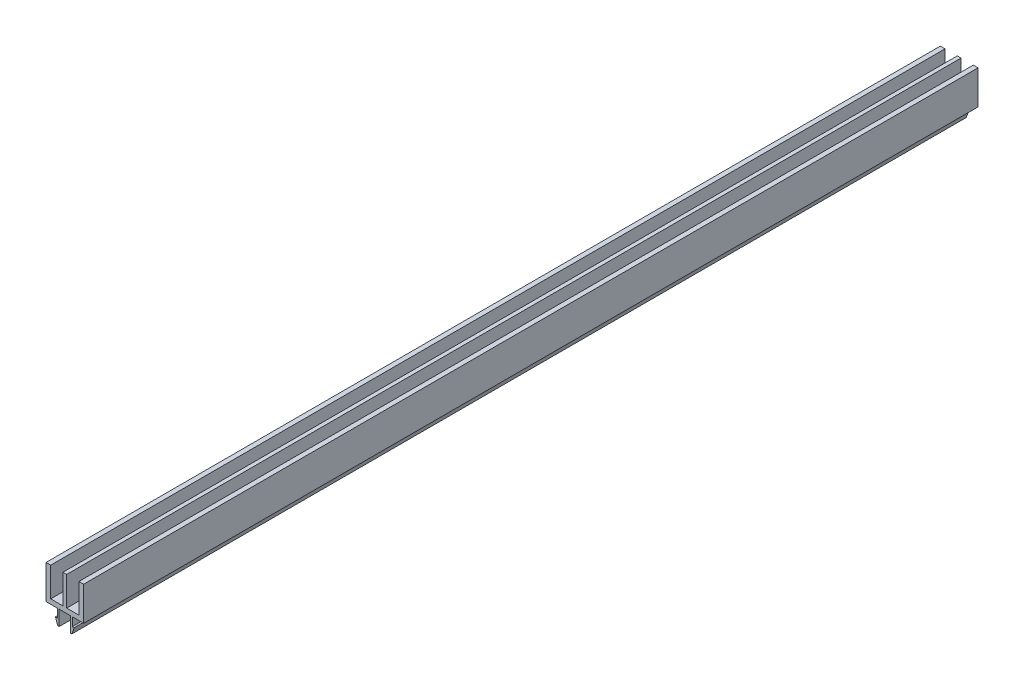
ISO-10303-21;
HEADER;
FILE_DESCRIPTION(('STEP AP214'),'2;1');
FILE_NAME('part.step','',(''),(''),'','','');
FILE_SCHEMA(('AUTOMOTIVE_DESIGN { 1 0 10303 214 1 1 1 1 }'));
ENDSEC;
DATA;
#1=APPLICATION_CONTEXT('core data for automotive mechanical design processes');
#2=APPLICATION_PROTOCOL_DEFINITION('international standard','automotive_design',2000,#1);
#3=PRODUCT_CONTEXT('',#1,'mechanical');
#4=PRODUCT('Part','Part','',(#3));
#5=PRODUCT_RELATED_PRODUCT_CATEGORY('part','',(#4));
#6=PRODUCT_DEFINITION_FORMATION('','',#4);
#7=PRODUCT_DEFINITION_CONTEXT('part definition',#1,'design');
#8=PRODUCT_DEFINITION('design','',#6,#7);
#9=PRODUCT_DEFINITION_SHAPE('','',#8);
#10=(LENGTH_UNIT() NAMED_UNIT(*) SI_UNIT(.MILLI.,.METRE.));
#11=(NAMED_UNIT(*) PLANE_ANGLE_UNIT() SI_UNIT($,.RADIAN.));
#12=(NAMED_UNIT(*) SI_UNIT($,.STERADIAN.) SOLID_ANGLE_UNIT());
#13=UNCERTAINTY_MEASURE_WITH_UNIT(LENGTH_MEASURE(1.E-05),#10,'distance_accuracy_value','');
#14=(GEOMETRIC_REPRESENTATION_CONTEXT(3) GLOBAL_UNCERTAINTY_ASSIGNED_CONTEXT((#13)) GLOBAL_UNIT_ASSIGNED_CONTEXT((#10,
#11,#12)) REPRESENTATION_CONTEXT('',''));
#15=CARTESIAN_POINT('',(0.,0.,0.));
#16=DIRECTION('',(0.,0.,1.));
#17=DIRECTION('',(1.,0.,0.));
#18=AXIS2_PLACEMENT_3D('',#15,#16,#17);
#19=CARTESIAN_POINT('',(-1.,17.9999999975,-425.));
#20=DIRECTION('',(-1.,0.,0.));
#21=DIRECTION('',(0.,-1.,0.));
#22=AXIS2_PLACEMENT_3D('',#19,#20,#21);
#23=PLANE('',#22);
#24=DIRECTION('',(0.,-1.,0.));
#25=VECTOR('',#24,1.);
#26=CARTESIAN_POINT('',(-1.,17.9999999975,50.));
#27=LINE('',#26,#25);
#28=CARTESIAN_POINT('',(-1.,17.9999999975,50.));
#29=VERTEX_POINT('',#28);
#30=CARTESIAN_POINT('',(-1.,2.4999999995,50.));
#31=VERTEX_POINT('',#30);
#32=EDGE_CURVE('E225',#29,#31,#27,.T.);
#33=ORIENTED_EDGE('',*,*,#32,.F.);
#34=DIRECTION('',(0.,0.,1.));
#35=VECTOR('',#34,1.);
#36=CARTESIAN_POINT('',(-1.,17.9999999975,-425.));
#37=LINE('',#36,#35);
#38=CARTESIAN_POINT('',(-1.,17.9999999975,-425.));
#39=VERTEX_POINT('',#38);
#40=EDGE_CURVE('E11',#39,#29,#37,.T.);
#41=ORIENTED_EDGE('',*,*,#40,.F.);
#42=DIRECTION('',(0.,-1.,0.));
#43=VECTOR('',#42,1.);
#44=CARTESIAN_POINT('',(-1.,17.9999999975,-425.));
#45=LINE('',#44,#43);
#46=CARTESIAN_POINT('',(-1.,2.4999999995,-425.));
#47=VERTEX_POINT('',#46);
#48=EDGE_CURVE('E293',#39,#47,#45,.T.);
#49=ORIENTED_EDGE('',*,*,#48,.T.);
#50=DIRECTION('',(0.,0.,1.));
#51=VECTOR('',#50,1.);
#52=CARTESIAN_POINT('',(-1.,2.4999999995,-425.));
#53=LINE('',#52,#51);
#54=EDGE_CURVE('E35',#47,#31,#53,.T.);
#55=ORIENTED_EDGE('',*,*,#54,.T.);
#56=EDGE_LOOP('',(#33,#41,#49,#55));
#57=FACE_BOUND('',#56,.T.);
#58=ADVANCED_FACE('F32',(#57),#23,.T.);
#59=CARTESIAN_POINT('',(0.999999999999998,17.9999999975,-425.));
#60=DIRECTION('',(0.,1.,0.));
#61=DIRECTION('',(0.,0.,1.));
#62=AXIS2_PLACEMENT_3D('',#59,#60,#61);
#63=PLANE('',#62);
#64=DIRECTION('',(-1.,0.,0.));
#65=VECTOR('',#64,1.);
#66=CARTESIAN_POINT('',(0.999999999999998,17.9999999975,50.));
#67=LINE('',#66,#65);
#68=CARTESIAN_POINT('',(0.999999999999998,17.9999999975,50.));
#69=VERTEX_POINT('',#68);
#70=EDGE_CURVE('E291',#69,#29,#67,.T.);
#71=ORIENTED_EDGE('',*,*,#70,.F.);
#72=DIRECTION('',(0.,0.,1.));
#73=VECTOR('',#72,1.);
#74=CARTESIAN_POINT('',(0.999999999999998,17.9999999975,-425.));
#75=LINE('',#74,#73);
#76=CARTESIAN_POINT('',(0.999999999999998,17.9999999975,-425.));
#77=VERTEX_POINT('',#76);
#78=EDGE_CURVE('E41',#77,#69,#75,.T.);
#79=ORIENTED_EDGE('',*,*,#78,.F.);
#80=DIRECTION('',(-1.,0.,0.));
#81=VECTOR('',#80,1.);
#82=CARTESIAN_POINT('',(0.999999999999998,17.9999999975,-425.));
#83=LINE('',#82,#81);
#84=EDGE_CURVE('E215',#77,#39,#83,.T.);
#85=ORIENTED_EDGE('',*,*,#84,.T.);
#86=ORIENTED_EDGE('',*,*,#40,.T.);
#87=EDGE_LOOP('',(#71,#79,#85,#86));
#88=FACE_BOUND('',#87,.T.);
#89=ADVANCED_FACE('F337',(#88),#63,.T.);
#90=CARTESIAN_POINT('',(0.999999999999998,2.4999999995,-425.));
#91=DIRECTION('',(1.,0.,0.));
#92=DIRECTION('',(0.,0.,-1.));
#93=AXIS2_PLACEMENT_3D('',#90,#91,#92);
#94=PLANE('',#93);
#95=DIRECTION('',(0.,1.,0.));
#96=VECTOR('',#95,1.);
#97=CARTESIAN_POINT('',(0.999999999999998,2.4999999995,50.));
#98=LINE('',#97,#96);
#99=CARTESIAN_POINT('',(0.999999999999998,2.4999999995,50.));
#100=VERTEX_POINT('',#99);
#101=EDGE_CURVE('E202',#100,#69,#98,.T.);
#102=ORIENTED_EDGE('',*,*,#101,.F.);
#103=DIRECTION('',(0.,0.,1.));
#104=VECTOR('',#103,1.);
#105=CARTESIAN_POINT('',(0.999999999999998,2.4999999995,-425.));
#106=LINE('',#105,#104);
#107=CARTESIAN_POINT('',(0.999999999999998,2.4999999995,-425.));
#108=VERTEX_POINT('',#107);
#109=EDGE_CURVE('E197',#108,#100,#106,.T.);
#110=ORIENTED_EDGE('',*,*,#109,.F.);
#111=DIRECTION('',(0.,1.,0.));
#112=VECTOR('',#111,1.);
#113=CARTESIAN_POINT('',(0.999999999999998,2.4999999995,-425.));
#114=LINE('',#113,#112);
#115=EDGE_CURVE('E200',#108,#77,#114,.T.);
#116=ORIENTED_EDGE('',*,*,#115,.T.);
#117=ORIENTED_EDGE('',*,*,#78,.T.);
#118=EDGE_LOOP('',(#102,#110,#116,#117));
#119=FACE_BOUND('',#118,.T.);
#120=ADVANCED_FACE('F199',(#119),#94,.T.);
#121=CARTESIAN_POINT('',(7.5,2.4999999995,-425.));
#122=DIRECTION('',(0.,1.,0.));
#123=DIRECTION('',(-1.,0.,0.));
#124=AXIS2_PLACEMENT_3D('',#121,#122,#123);
#125=PLANE('',#124);
#126=DIRECTION('',(-1.,0.,0.));
#127=VECTOR('',#126,1.);
#128=CARTESIAN_POINT('',(7.5,2.4999999995,50.));
#129=LINE('',#128,#127);
#130=CARTESIAN_POINT('',(7.5,2.4999999995,50.));
#131=VERTEX_POINT('',#130);
#132=EDGE_CURVE('E288',#131,#100,#129,.T.);
#133=ORIENTED_EDGE('',*,*,#132,.F.);
#134=DIRECTION('',(0.,0.,1.));
#135=VECTOR('',#134,1.);
#136=CARTESIAN_POINT('',(7.5,2.4999999995,-425.));
#137=LINE('',#136,#135);
#138=CARTESIAN_POINT('',(7.5,2.4999999995,-425.));
#139=VERTEX_POINT('',#138);
#140=EDGE_CURVE('E207',#139,#131,#137,.T.);
#141=ORIENTED_EDGE('',*,*,#140,.F.);
#142=DIRECTION('',(-1.,0.,0.));
#143=VECTOR('',#142,1.);
#144=CARTESIAN_POINT('',(7.5,2.4999999995,-425.));
#145=LINE('',#144,#143);
#146=EDGE_CURVE('E213',#139,#108,#145,.T.);
#147=ORIENTED_EDGE('',*,*,#146,.T.);
#148=ORIENTED_EDGE('',*,*,#109,.T.);
#149=EDGE_LOOP('',(#133,#141,#147,#148));
#150=FACE_BOUND('',#149,.T.);
#151=ADVANCED_FACE('F217',(#150),#125,.T.);
#152=CARTESIAN_POINT('',(7.5,17.9999999975,-425.));
#153=DIRECTION('',(-1.,0.,0.));
#154=DIRECTION('',(0.,-1.,0.));
#155=AXIS2_PLACEMENT_3D('',#152,#153,#154);
#156=PLANE('',#155);
#157=DIRECTION('',(0.,-1.,0.));
#158=VECTOR('',#157,1.);
#159=CARTESIAN_POINT('',(7.5,17.9999999975,50.));
#160=LINE('',#159,#158);
#161=CARTESIAN_POINT('',(7.5,17.9999999975,50.));
#162=VERTEX_POINT('',#161);
#163=EDGE_CURVE('E285',#162,#131,#160,.T.);
#164=ORIENTED_EDGE('',*,*,#163,.F.);
#165=DIRECTION('',(0.,0.,1.));
#166=VECTOR('',#165,1.);
#167=CARTESIAN_POINT('',(7.5,17.9999999975,-425.));
#168=LINE('',#167,#166);
#169=CARTESIAN_POINT('',(7.5,17.9999999975,-425.));
#170=VERTEX_POINT('',#169);
#171=EDGE_CURVE('E297',#170,#162,#168,.T.);
#172=ORIENTED_EDGE('',*,*,#171,.F.);
#173=DIRECTION('',(0.,-1.,0.));
#174=VECTOR('',#173,1.);
#175=CARTESIAN_POINT('',(7.5,17.9999999975,-425.));
#176=LINE('',#175,#174);
#177=EDGE_CURVE('E218',#170,#139,#176,.T.);
#178=ORIENTED_EDGE('',*,*,#177,.T.);
#179=ORIENTED_EDGE('',*,*,#140,.T.);
#180=EDGE_LOOP('',(#164,#172,#178,#179));
#181=FACE_BOUND('',#180,.T.);
#182=ADVANCED_FACE('F350',(#181),#156,.T.);
#183=CARTESIAN_POINT('',(10.,17.9999999975,-425.));
#184=DIRECTION('',(0.,1.,0.));
#185=DIRECTION('',(0.,0.,1.));
#186=AXIS2_PLACEMENT_3D('',#183,#184,#185);
#187=PLANE('',#186);
#188=DIRECTION('',(-1.,0.,0.));
#189=VECTOR('',#188,1.);
#190=CARTESIAN_POINT('',(10.,17.9999999975,50.));
#191=LINE('',#190,#189);
#192=CARTESIAN_POINT('',(10.,17.9999999975,50.));
#193=VERTEX_POINT('',#192);
#194=EDGE_CURVE('E282',#193,#162,#191,.T.);
#195=ORIENTED_EDGE('',*,*,#194,.F.);
#196=DIRECTION('',(0.,0.,1.));
#197=VECTOR('',#196,1.);
#198=CARTESIAN_POINT('',(10.,17.9999999975,-425.));
#199=LINE('',#198,#197);
#200=CARTESIAN_POINT('',(10.,17.9999999975,-425.));
#201=VERTEX_POINT('',#200);
#202=EDGE_CURVE('E299',#201,#193,#199,.T.);
#203=ORIENTED_EDGE('',*,*,#202,.F.);
#204=DIRECTION('',(-1.,0.,0.));
#205=VECTOR('',#204,1.);
#206=CARTESIAN_POINT('',(10.,17.9999999975,-425.));
#207=LINE('',#206,#205);
#208=EDGE_CURVE('E220',#201,#170,#207,.T.);
#209=ORIENTED_EDGE('',*,*,#208,.T.);
#210=ORIENTED_EDGE('',*,*,#171,.T.);
#211=EDGE_LOOP('',(#195,#203,#209,#210));
#212=FACE_BOUND('',#211,.T.);
#213=ADVANCED_FACE('F353',(#212),#187,.T.);
#214=CARTESIAN_POINT('',(10.,-4.99999828349541E-10,-425.));
#215=DIRECTION('',(1.,0.,0.));
#216=DIRECTION('',(0.,0.,-1.));
#217=AXIS2_PLACEMENT_3D('',#214,#215,#216);
#218=PLANE('',#217);
#219=DIRECTION('',(0.,1.,0.));
#220=VECTOR('',#219,1.);
#221=CARTESIAN_POINT('',(10.,-4.99999828349541E-10,50.));
#222=LINE('',#221,#220);
#223=CARTESIAN_POINT('',(10.,-4.99999828349541E-10,50.));
#224=VERTEX_POINT('',#223);
#225=EDGE_CURVE('E279',#224,#193,#222,.T.);
#226=ORIENTED_EDGE('',*,*,#225,.F.);
#227=DIRECTION('',(0.,0.,1.));
#228=VECTOR('',#227,1.);
#229=CARTESIAN_POINT('',(10.,-4.99999828349541E-10,-425.));
#230=LINE('',#229,#228);
#231=CARTESIAN_POINT('',(10.,-4.99999828349541E-10,-425.));
#232=VERTEX_POINT('',#231);
#233=EDGE_CURVE('E301',#232,#224,#230,.T.);
#234=ORIENTED_EDGE('',*,*,#233,.F.);
#235=DIRECTION('',(0.,1.,0.));
#236=VECTOR('',#235,1.);
#237=CARTESIAN_POINT('',(10.,-4.99999828349541E-10,-425.));
#238=LINE('',#237,#236);
#239=EDGE_CURVE('E643',#232,#201,#238,.T.);
#240=ORIENTED_EDGE('',*,*,#239,.T.);
#241=ORIENTED_EDGE('',*,*,#202,.T.);
#242=EDGE_LOOP('',(#226,#234,#240,#241));
#243=FACE_BOUND('',#242,.T.);
#244=ADVANCED_FACE('F357',(#243),#218,.T.);
#245=CARTESIAN_POINT('',(4.,-4.99999998002099E-10,-425.));
#246=DIRECTION('',(0.,-1.,0.));
#247=DIRECTION('',(1.,0.,0.));
#248=AXIS2_PLACEMENT_3D('',#245,#246,#247);
#249=PLANE('',#248);
#250=DIRECTION('',(1.,0.,0.));
#251=VECTOR('',#250,1.);
#252=CARTESIAN_POINT('',(4.,-4.99999998002099E-10,50.));
#253=LINE('',#252,#251);
#254=CARTESIAN_POINT('',(4.,-4.99999998002099E-10,50.));
#255=VERTEX_POINT('',#254);
#256=EDGE_CURVE('E276',#255,#224,#253,.T.);
#257=ORIENTED_EDGE('',*,*,#256,.F.);
#258=DIRECTION('',(0.,0.,1.));
#259=VECTOR('',#258,1.);
#260=CARTESIAN_POINT('',(4.,-4.99999998002099E-10,-425.));
#261=LINE('',#260,#259);
#262=CARTESIAN_POINT('',(4.,-4.99999998002099E-10,-425.));
#263=VERTEX_POINT('',#262);
#264=EDGE_CURVE('E303',#263,#255,#261,.T.);
#265=ORIENTED_EDGE('',*,*,#264,.F.);
#266=DIRECTION('',(1.,0.,0.));
#267=VECTOR('',#266,1.);
#268=CARTESIAN_POINT('',(4.,-4.99999998002099E-10,-425.));
#269=LINE('',#268,#267);
#270=EDGE_CURVE('E647',#263,#232,#269,.T.);
#271=ORIENTED_EDGE('',*,*,#270,.T.);
#272=ORIENTED_EDGE('',*,*,#233,.T.);
#273=EDGE_LOOP('',(#257,#265,#271,#272));
#274=FACE_BOUND('',#273,.T.);
#275=ADVANCED_FACE('F361',(#274),#249,.T.);
#276=CARTESIAN_POINT('',(4.,-4.5,-425.));
#277=DIRECTION('',(1.,0.,0.));
#278=DIRECTION('',(0.,0.,-1.));
#279=AXIS2_PLACEMENT_3D('',#276,#277,#278);
#280=PLANE('',#279);
#281=DIRECTION('',(0.,1.,0.));
#282=VECTOR('',#281,1.);
#283=CARTESIAN_POINT('',(4.,-4.5,50.));
#284=LINE('',#283,#282);
#285=CARTESIAN_POINT('',(4.,-4.5,50.));
#286=VERTEX_POINT('',#285);
#287=EDGE_CURVE('E273',#286,#255,#284,.T.);
#288=ORIENTED_EDGE('',*,*,#287,.F.);
#289=DIRECTION('',(0.,0.,1.));
#290=VECTOR('',#289,1.);
#291=CARTESIAN_POINT('',(4.,-4.5,-425.));
#292=LINE('',#291,#290);
#293=CARTESIAN_POINT('',(4.,-4.5,-425.));
#294=VERTEX_POINT('',#293);
#295=EDGE_CURVE('E305',#294,#286,#292,.T.);
#296=ORIENTED_EDGE('',*,*,#295,.F.);
#297=DIRECTION('',(0.,1.,0.));
#298=VECTOR('',#297,1.);
#299=CARTESIAN_POINT('',(4.,-4.5,-425.));
#300=LINE('',#299,#298);
#301=EDGE_CURVE('E636',#294,#263,#300,.T.);
#302=ORIENTED_EDGE('',*,*,#301,.T.);
#303=ORIENTED_EDGE('',*,*,#264,.T.);
#304=EDGE_LOOP('',(#288,#296,#302,#303));
#305=FACE_BOUND('',#304,.T.);
#306=ADVANCED_FACE('F365',(#305),#280,.T.);
#307=CARTESIAN_POINT('',(5.,-4.5,-425.));
#308=DIRECTION('',(0.,1.,0.));
#309=DIRECTION('',(0.,0.,1.));
#310=AXIS2_PLACEMENT_3D('',#307,#308,#309);
#311=PLANE('',#310);
#312=DIRECTION('',(-1.,0.,0.));
#313=VECTOR('',#312,1.);
#314=CARTESIAN_POINT('',(5.,-4.5,50.));
#315=LINE('',#314,#313);
#316=CARTESIAN_POINT('',(5.,-4.5,50.));
#317=VERTEX_POINT('',#316);
#318=EDGE_CURVE('E270',#317,#286,#315,.T.);
#319=ORIENTED_EDGE('',*,*,#318,.F.);
#320=DIRECTION('',(0.,0.,1.));
#321=VECTOR('',#320,1.);
#322=CARTESIAN_POINT('',(5.,-4.5,-425.));
#323=LINE('',#322,#321);
#324=CARTESIAN_POINT('',(5.,-4.5,-425.));
#325=VERTEX_POINT('',#324);
#326=EDGE_CURVE('E307',#325,#317,#323,.T.);
#327=ORIENTED_EDGE('',*,*,#326,.F.);
#328=DIRECTION('',(-1.,0.,0.));
#329=VECTOR('',#328,1.);
#330=CARTESIAN_POINT('',(5.,-4.5,-425.));
#331=LINE('',#330,#329);
#332=EDGE_CURVE('E632',#325,#294,#331,.T.);
#333=ORIENTED_EDGE('',*,*,#332,.T.);
#334=ORIENTED_EDGE('',*,*,#295,.T.);
#335=EDGE_LOOP('',(#319,#327,#333,#334));
#336=FACE_BOUND('',#335,.T.);
#337=ADVANCED_FACE('F369',(#336),#311,.T.);
#338=CARTESIAN_POINT('',(3.75,-8.,-425.));
#339=DIRECTION('',(0.941741911594837,-0.336336396998156,0.));
#340=DIRECTION('',(0.336336396998157,0.941741911594838,0.));
#341=AXIS2_PLACEMENT_3D('',#338,#339,#340);
#342=PLANE('',#341);
#343=DIRECTION('',(0.336336396998157,0.941741911594837,0.));
#344=VECTOR('',#343,1.);
#345=CARTESIAN_POINT('',(3.75,-8.,50.));
#346=LINE('',#345,#344);
#347=CARTESIAN_POINT('',(3.75,-8.,50.));
#348=VERTEX_POINT('',#347);
#349=EDGE_CURVE('E267',#348,#317,#346,.T.);
#350=ORIENTED_EDGE('',*,*,#349,.F.);
#351=DIRECTION('',(0.,0.,1.));
#352=VECTOR('',#351,1.);
#353=CARTESIAN_POINT('',(3.75,-8.,-425.));
#354=LINE('',#353,#352);
#355=CARTESIAN_POINT('',(3.75,-8.,-425.));
#356=VERTEX_POINT('',#355);
#357=EDGE_CURVE('E309',#356,#348,#354,.T.);
#358=ORIENTED_EDGE('',*,*,#357,.F.);
#359=DIRECTION('',(0.336336396998157,0.941741911594837,0.));
#360=VECTOR('',#359,1.);
#361=CARTESIAN_POINT('',(3.75,-8.,-425.));
#362=LINE('',#361,#360);
#363=EDGE_CURVE('E653',#356,#325,#362,.T.);
#364=ORIENTED_EDGE('',*,*,#363,.T.);
#365=ORIENTED_EDGE('',*,*,#326,.T.);
#366=EDGE_LOOP('',(#350,#358,#364,#365));
#367=FACE_BOUND('',#366,.T.);
#368=ADVANCED_FACE('F373',(#367),#342,.T.);
#369=CARTESIAN_POINT('',(3.,-8.,-425.));
#370=DIRECTION('',(0.,-1.,0.));
#371=DIRECTION('',(0.,0.,-1.));
#372=AXIS2_PLACEMENT_3D('',#369,#370,#371);
#373=PLANE('',#372);
#374=DIRECTION('',(1.,0.,0.));
#375=VECTOR('',#374,1.);
#376=CARTESIAN_POINT('',(3.,-8.,50.));
#377=LINE('',#376,#375);
#378=CARTESIAN_POINT('',(3.,-8.,50.));
#379=VERTEX_POINT('',#378);
#380=EDGE_CURVE('E264',#379,#348,#377,.T.);
#381=ORIENTED_EDGE('',*,*,#380,.F.);
#382=DIRECTION('',(0.,0.,1.));
#383=VECTOR('',#382,1.);
#384=CARTESIAN_POINT('',(3.,-8.,-425.));
#385=LINE('',#384,#383);
#386=CARTESIAN_POINT('',(3.,-8.,-425.));
#387=VERTEX_POINT('',#386);
#388=EDGE_CURVE('E311',#387,#379,#385,.T.);
#389=ORIENTED_EDGE('',*,*,#388,.F.);
#390=DIRECTION('',(1.,0.,0.));
#391=VECTOR('',#390,1.);
#392=CARTESIAN_POINT('',(3.,-8.,-425.));
#393=LINE('',#392,#391);
#394=EDGE_CURVE('E625',#387,#356,#393,.T.);
#395=ORIENTED_EDGE('',*,*,#394,.T.);
#396=ORIENTED_EDGE('',*,*,#357,.T.);
#397=EDGE_LOOP('',(#381,#389,#395,#396));
#398=FACE_BOUND('',#397,.T.);
#399=ADVANCED_FACE('F377',(#398),#373,.T.);
#400=CARTESIAN_POINT('',(3.,-4.9999985194348E-10,-425.));
#401=DIRECTION('',(-1.,0.,0.));
#402=DIRECTION('',(0.,0.,1.));
#403=AXIS2_PLACEMENT_3D('',#400,#401,#402);
#404=PLANE('',#403);
#405=DIRECTION('',(0.,-1.,0.));
#406=VECTOR('',#405,1.);
#407=CARTESIAN_POINT('',(3.,-4.9999985194348E-10,50.));
#408=LINE('',#407,#406);
#409=CARTESIAN_POINT('',(3.,-4.9999985194348E-10,50.));
#410=VERTEX_POINT('',#409);
#411=EDGE_CURVE('E261',#410,#379,#408,.T.);
#412=ORIENTED_EDGE('',*,*,#411,.F.);
#413=DIRECTION('',(0.,0.,1.));
#414=VECTOR('',#413,1.);
#415=CARTESIAN_POINT('',(3.,-4.9999985194348E-10,-425.));
#416=LINE('',#415,#414);
#417=CARTESIAN_POINT('',(3.,-4.9999985194348E-10,-425.));
#418=VERTEX_POINT('',#417);
#419=EDGE_CURVE('E313',#418,#410,#416,.T.);
#420=ORIENTED_EDGE('',*,*,#419,.F.);
#421=DIRECTION('',(0.,-1.,0.));
#422=VECTOR('',#421,1.);
#423=CARTESIAN_POINT('',(3.,-4.9999985194348E-10,-425.));
#424=LINE('',#423,#422);
#425=EDGE_CURVE('E621',#418,#387,#424,.T.);
#426=ORIENTED_EDGE('',*,*,#425,.T.);
#427=ORIENTED_EDGE('',*,*,#388,.T.);
#428=EDGE_LOOP('',(#412,#420,#426,#427));
#429=FACE_BOUND('',#428,.T.);
#430=ADVANCED_FACE('F381',(#429),#404,.T.);
#431=CARTESIAN_POINT('',(-3.,-4.99999455901012E-10,-425.));
#432=DIRECTION('',(0.,-1.,0.));
#433=DIRECTION('',(1.,0.,0.));
#434=AXIS2_PLACEMENT_3D('',#431,#432,#433);
#435=PLANE('',#434);
#436=DIRECTION('',(1.,0.,0.));
#437=VECTOR('',#436,1.);
#438=CARTESIAN_POINT('',(-3.,-4.99999455901012E-10,50.));
#439=LINE('',#438,#437);
#440=CARTESIAN_POINT('',(-3.,-4.99999455901012E-10,50.));
#441=VERTEX_POINT('',#440);
#442=EDGE_CURVE('E258',#441,#410,#439,.T.);
#443=ORIENTED_EDGE('',*,*,#442,.F.);
#444=DIRECTION('',(0.,0.,1.));
#445=VECTOR('',#444,1.);
#446=CARTESIAN_POINT('',(-3.,-4.99999455901012E-10,-425.));
#447=LINE('',#446,#445);
#448=CARTESIAN_POINT('',(-3.,-4.99999455901012E-10,-425.));
#449=VERTEX_POINT('',#448);
#450=EDGE_CURVE('E315',#449,#441,#447,.T.);
#451=ORIENTED_EDGE('',*,*,#450,.F.);
#452=DIRECTION('',(1.,0.,0.));
#453=VECTOR('',#452,1.);
#454=CARTESIAN_POINT('',(-3.,-4.99999455901012E-10,-425.));
#455=LINE('',#454,#453);
#456=EDGE_CURVE('E657',#449,#418,#455,.T.);
#457=ORIENTED_EDGE('',*,*,#456,.T.);
#458=ORIENTED_EDGE('',*,*,#419,.T.);
#459=EDGE_LOOP('',(#443,#451,#457,#458));
#460=FACE_BOUND('',#459,.T.);
#461=ADVANCED_FACE('F385',(#460),#435,.T.);
#462=CARTESIAN_POINT('',(-3.,-8.,-425.));
#463=DIRECTION('',(1.,0.,0.));
#464=DIRECTION('',(0.,0.,-1.));
#465=AXIS2_PLACEMENT_3D('',#462,#463,#464);
#466=PLANE('',#465);
#467=DIRECTION('',(0.,1.,0.));
#468=VECTOR('',#467,1.);
#469=CARTESIAN_POINT('',(-3.,-8.,50.));
#470=LINE('',#469,#468);
#471=CARTESIAN_POINT('',(-3.,-8.,50.));
#472=VERTEX_POINT('',#471);
#473=EDGE_CURVE('E255',#472,#441,#470,.T.);
#474=ORIENTED_EDGE('',*,*,#473,.F.);
#475=DIRECTION('',(0.,0.,1.));
#476=VECTOR('',#475,1.);
#477=CARTESIAN_POINT('',(-3.,-8.,-425.));
#478=LINE('',#477,#476);
#479=CARTESIAN_POINT('',(-3.,-8.,-425.));
#480=VERTEX_POINT('',#479);
#481=EDGE_CURVE('E317',#480,#472,#478,.T.);
#482=ORIENTED_EDGE('',*,*,#481,.F.);
#483=DIRECTION('',(0.,1.,0.));
#484=VECTOR('',#483,1.);
#485=CARTESIAN_POINT('',(-3.,-8.,-425.));
#486=LINE('',#485,#484);
#487=EDGE_CURVE('E614',#480,#449,#486,.T.);
#488=ORIENTED_EDGE('',*,*,#487,.T.);
#489=ORIENTED_EDGE('',*,*,#450,.T.);
#490=EDGE_LOOP('',(#474,#482,#488,#489));
#491=FACE_BOUND('',#490,.T.);
#492=ADVANCED_FACE('F389',(#491),#466,.T.);
#493=CARTESIAN_POINT('',(-3.75,-8.,-425.));
#494=DIRECTION('',(0.,-1.,0.));
#495=DIRECTION('',(0.,0.,-1.));
#496=AXIS2_PLACEMENT_3D('',#493,#494,#495);
#497=PLANE('',#496);
#498=DIRECTION('',(1.,0.,0.));
#499=VECTOR('',#498,1.);
#500=CARTESIAN_POINT('',(-3.75,-8.,50.));
#501=LINE('',#500,#499);
#502=CARTESIAN_POINT('',(-3.75,-8.,50.));
#503=VERTEX_POINT('',#502);
#504=EDGE_CURVE('E252',#503,#472,#501,.T.);
#505=ORIENTED_EDGE('',*,*,#504,.F.);
#506=DIRECTION('',(0.,0.,1.));
#507=VECTOR('',#506,1.);
#508=CARTESIAN_POINT('',(-3.75,-8.,-425.));
#509=LINE('',#508,#507);
#510=CARTESIAN_POINT('',(-3.75,-8.,-425.));
#511=VERTEX_POINT('',#510);
#512=EDGE_CURVE('E319',#511,#503,#509,.T.);
#513=ORIENTED_EDGE('',*,*,#512,.F.);
#514=DIRECTION('',(1.,0.,0.));
#515=VECTOR('',#514,1.);
#516=CARTESIAN_POINT('',(-3.75,-8.,-425.));
#517=LINE('',#516,#515);
#518=EDGE_CURVE('E610',#511,#480,#517,.T.);
#519=ORIENTED_EDGE('',*,*,#518,.T.);
#520=ORIENTED_EDGE('',*,*,#481,.T.);
#521=EDGE_LOOP('',(#505,#513,#519,#520));
#522=FACE_BOUND('',#521,.T.);
#523=ADVANCED_FACE('F393',(#522),#497,.T.);
#524=CARTESIAN_POINT('',(-5.,-4.5,-425.));
#525=DIRECTION('',(-0.941741911594837,-0.336336396998156,0.));
#526=DIRECTION('',(0.336336396998156,-0.941741911594837,0.));
#527=AXIS2_PLACEMENT_3D('',#524,#525,#526);
#528=PLANE('',#527);
#529=DIRECTION('',(0.336336396998156,-0.941741911594837,0.));
#530=VECTOR('',#529,1.);
#531=CARTESIAN_POINT('',(-5.,-4.5,50.));
#532=LINE('',#531,#530);
#533=CARTESIAN_POINT('',(-5.,-4.5,50.));
#534=VERTEX_POINT('',#533);
#535=EDGE_CURVE('E249',#534,#503,#532,.T.);
#536=ORIENTED_EDGE('',*,*,#535,.F.);
#537=DIRECTION('',(0.,0.,1.));
#538=VECTOR('',#537,1.);
#539=CARTESIAN_POINT('',(-5.,-4.5,-425.));
#540=LINE('',#539,#538);
#541=CARTESIAN_POINT('',(-5.,-4.5,-425.));
#542=VERTEX_POINT('',#541);
#543=EDGE_CURVE('E321',#542,#534,#540,.T.);
#544=ORIENTED_EDGE('',*,*,#543,.F.);
#545=DIRECTION('',(0.336336396998156,-0.941741911594837,0.));
#546=VECTOR('',#545,1.);
#547=CARTESIAN_POINT('',(-5.,-4.5,-425.));
#548=LINE('',#547,#546);
#549=EDGE_CURVE('E661',#542,#511,#548,.T.);
#550=ORIENTED_EDGE('',*,*,#549,.T.);
#551=ORIENTED_EDGE('',*,*,#512,.T.);
#552=EDGE_LOOP('',(#536,#544,#550,#551));
#553=FACE_BOUND('',#552,.T.);
#554=ADVANCED_FACE('F397',(#553),#528,.T.);
#555=CARTESIAN_POINT('',(-4.,-4.5,-425.));
#556=DIRECTION('',(0.,1.,0.));
#557=DIRECTION('',(0.,0.,1.));
#558=AXIS2_PLACEMENT_3D('',#555,#556,#557);
#559=PLANE('',#558);
#560=DIRECTION('',(-1.,0.,0.));
#561=VECTOR('',#560,1.);
#562=CARTESIAN_POINT('',(-4.,-4.5,50.));
#563=LINE('',#562,#561);
#564=CARTESIAN_POINT('',(-4.,-4.5,50.));
#565=VERTEX_POINT('',#564);
#566=EDGE_CURVE('E246',#565,#534,#563,.T.);
#567=ORIENTED_EDGE('',*,*,#566,.F.);
#568=DIRECTION('',(0.,0.,1.));
#569=VECTOR('',#568,1.);
#570=CARTESIAN_POINT('',(-4.,-4.5,-425.));
#571=LINE('',#570,#569);
#572=CARTESIAN_POINT('',(-4.,-4.5,-425.));
#573=VERTEX_POINT('',#572);
#574=EDGE_CURVE('E323',#573,#565,#571,.T.);
#575=ORIENTED_EDGE('',*,*,#574,.F.);
#576=DIRECTION('',(-1.,0.,0.));
#577=VECTOR('',#576,1.);
#578=CARTESIAN_POINT('',(-4.,-4.5,-425.));
#579=LINE('',#578,#577);
#580=EDGE_CURVE('E603',#573,#542,#579,.T.);
#581=ORIENTED_EDGE('',*,*,#580,.T.);
#582=ORIENTED_EDGE('',*,*,#543,.T.);
#583=EDGE_LOOP('',(#567,#575,#581,#582));
#584=FACE_BOUND('',#583,.T.);
#585=ADVANCED_FACE('F401',(#584),#559,.T.);
#586=CARTESIAN_POINT('',(-4.,-4.9999985194348E-10,-425.));
#587=DIRECTION('',(-1.,0.,0.));
#588=DIRECTION('',(0.,0.,1.));
#589=AXIS2_PLACEMENT_3D('',#586,#587,#588);
#590=PLANE('',#589);
#591=DIRECTION('',(0.,-1.,0.));
#592=VECTOR('',#591,1.);
#593=CARTESIAN_POINT('',(-4.,-4.9999985194348E-10,50.));
#594=LINE('',#593,#592);
#595=CARTESIAN_POINT('',(-4.,-4.9999985194348E-10,50.));
#596=VERTEX_POINT('',#595);
#597=EDGE_CURVE('E243',#596,#565,#594,.T.);
#598=ORIENTED_EDGE('',*,*,#597,.F.);
#599=DIRECTION('',(0.,0.,1.));
#600=VECTOR('',#599,1.);
#601=CARTESIAN_POINT('',(-4.,-4.9999985194348E-10,-425.));
#602=LINE('',#601,#600);
#603=CARTESIAN_POINT('',(-4.,-4.9999985194348E-10,-425.));
#604=VERTEX_POINT('',#603);
#605=EDGE_CURVE('E325',#604,#596,#602,.T.);
#606=ORIENTED_EDGE('',*,*,#605,.F.);
#607=DIRECTION('',(0.,-1.,0.));
#608=VECTOR('',#607,1.);
#609=CARTESIAN_POINT('',(-4.,-4.9999985194348E-10,-425.));
#610=LINE('',#609,#608);
#611=EDGE_CURVE('E599',#604,#573,#610,.T.);
#612=ORIENTED_EDGE('',*,*,#611,.T.);
#613=ORIENTED_EDGE('',*,*,#574,.T.);
#614=EDGE_LOOP('',(#598,#606,#612,#613));
#615=FACE_BOUND('',#614,.T.);
#616=ADVANCED_FACE('F405',(#615),#590,.T.);
#617=CARTESIAN_POINT('',(-10.,-4.99999719929324E-10,-425.));
#618=DIRECTION('',(0.,-1.,0.));
#619=DIRECTION('',(1.,0.,0.));
#620=AXIS2_PLACEMENT_3D('',#617,#618,#619);
#621=PLANE('',#620);
#622=DIRECTION('',(1.,0.,0.));
#623=VECTOR('',#622,1.);
#624=CARTESIAN_POINT('',(-10.,-4.99999719929324E-10,50.));
#625=LINE('',#624,#623);
#626=CARTESIAN_POINT('',(-10.,-4.99999719929324E-10,50.));
#627=VERTEX_POINT('',#626);
#628=EDGE_CURVE('E240',#627,#596,#625,.T.);
#629=ORIENTED_EDGE('',*,*,#628,.F.);
#630=DIRECTION('',(0.,0.,1.));
#631=VECTOR('',#630,1.);
#632=CARTESIAN_POINT('',(-10.,-4.99999719929324E-10,-425.));
#633=LINE('',#632,#631);
#634=CARTESIAN_POINT('',(-10.,-4.99999719929324E-10,-425.));
#635=VERTEX_POINT('',#634);
#636=EDGE_CURVE('E327',#635,#627,#633,.T.);
#637=ORIENTED_EDGE('',*,*,#636,.F.);
#638=DIRECTION('',(1.,0.,0.));
#639=VECTOR('',#638,1.);
#640=CARTESIAN_POINT('',(-10.,-4.99999719929324E-10,-425.));
#641=LINE('',#640,#639);
#642=EDGE_CURVE('E665',#635,#604,#641,.T.);
#643=ORIENTED_EDGE('',*,*,#642,.T.);
#644=ORIENTED_EDGE('',*,*,#605,.T.);
#645=EDGE_LOOP('',(#629,#637,#643,#644));
#646=FACE_BOUND('',#645,.T.);
#647=ADVANCED_FACE('F409',(#646),#621,.T.);
#648=CARTESIAN_POINT('',(-10.,17.9999999975,-425.));
#649=DIRECTION('',(-1.,0.,0.));
#650=DIRECTION('',(0.,-1.,0.));
#651=AXIS2_PLACEMENT_3D('',#648,#649,#650);
#652=PLANE('',#651);
#653=DIRECTION('',(0.,-1.,0.));
#654=VECTOR('',#653,1.);
#655=CARTESIAN_POINT('',(-10.,17.9999999975,50.));
#656=LINE('',#655,#654);
#657=CARTESIAN_POINT('',(-10.,17.9999999975,50.));
#658=VERTEX_POINT('',#657);
#659=EDGE_CURVE('E237',#658,#627,#656,.T.);
#660=ORIENTED_EDGE('',*,*,#659,.F.);
#661=DIRECTION('',(0.,0.,1.));
#662=VECTOR('',#661,1.);
#663=CARTESIAN_POINT('',(-10.,17.9999999975,-425.));
#664=LINE('',#663,#662);
#665=CARTESIAN_POINT('',(-10.,17.9999999975,-425.));
#666=VERTEX_POINT('',#665);
#667=EDGE_CURVE('E329',#666,#658,#664,.T.);
#668=ORIENTED_EDGE('',*,*,#667,.F.);
#669=DIRECTION('',(0.,-1.,0.));
#670=VECTOR('',#669,1.);
#671=CARTESIAN_POINT('',(-10.,17.9999999975,-425.));
#672=LINE('',#671,#670);
#673=EDGE_CURVE('E592',#666,#635,#672,.T.);
#674=ORIENTED_EDGE('',*,*,#673,.T.);
#675=ORIENTED_EDGE('',*,*,#636,.T.);
#676=EDGE_LOOP('',(#660,#668,#674,#675));
#677=FACE_BOUND('',#676,.T.);
#678=ADVANCED_FACE('F413',(#677),#652,.T.);
#679=CARTESIAN_POINT('',(-7.5,17.9999999975,-425.));
#680=DIRECTION('',(0.,1.,0.));
#681=DIRECTION('',(0.,0.,1.));
#682=AXIS2_PLACEMENT_3D('',#679,#680,#681);
#683=PLANE('',#682);
#684=DIRECTION('',(-1.,0.,0.));
#685=VECTOR('',#684,1.);
#686=CARTESIAN_POINT('',(-7.5,17.9999999975,50.));
#687=LINE('',#686,#685);
#688=CARTESIAN_POINT('',(-7.5,17.9999999975,50.));
#689=VERTEX_POINT('',#688);
#690=EDGE_CURVE('E234',#689,#658,#687,.T.);
#691=ORIENTED_EDGE('',*,*,#690,.F.);
#692=DIRECTION('',(0.,0.,1.));
#693=VECTOR('',#692,1.);
#694=CARTESIAN_POINT('',(-7.5,17.9999999975,-425.));
#695=LINE('',#694,#693);
#696=CARTESIAN_POINT('',(-7.5,17.9999999975,-425.));
#697=VERTEX_POINT('',#696);
#698=EDGE_CURVE('E331',#697,#689,#695,.T.);
#699=ORIENTED_EDGE('',*,*,#698,.F.);
#700=DIRECTION('',(-1.,0.,0.));
#701=VECTOR('',#700,1.);
#702=CARTESIAN_POINT('',(-7.5,17.9999999975,-425.));
#703=LINE('',#702,#701);
#704=EDGE_CURVE('E588',#697,#666,#703,.T.);
#705=ORIENTED_EDGE('',*,*,#704,.T.);
#706=ORIENTED_EDGE('',*,*,#667,.T.);
#707=EDGE_LOOP('',(#691,#699,#705,#706));
#708=FACE_BOUND('',#707,.T.);
#709=ADVANCED_FACE('F417',(#708),#683,.T.);
#710=CARTESIAN_POINT('',(-7.5,2.4999999995,-425.));
#711=DIRECTION('',(1.,0.,0.));
#712=DIRECTION('',(0.,0.,-1.));
#713=AXIS2_PLACEMENT_3D('',#710,#711,#712);
#714=PLANE('',#713);
#715=DIRECTION('',(0.,1.,0.));
#716=VECTOR('',#715,1.);
#717=CARTESIAN_POINT('',(-7.5,2.4999999995,50.));
#718=LINE('',#717,#716);
#719=CARTESIAN_POINT('',(-7.5,2.4999999995,50.));
#720=VERTEX_POINT('',#719);
#721=EDGE_CURVE('E231',#720,#689,#718,.T.);
#722=ORIENTED_EDGE('',*,*,#721,.F.);
#723=DIRECTION('',(0.,0.,1.));
#724=VECTOR('',#723,1.);
#725=CARTESIAN_POINT('',(-7.5,2.4999999995,-425.));
#726=LINE('',#725,#724);
#727=CARTESIAN_POINT('',(-7.5,2.4999999995,-425.));
#728=VERTEX_POINT('',#727);
#729=EDGE_CURVE('E332',#728,#720,#726,.T.);
#730=ORIENTED_EDGE('',*,*,#729,.F.);
#731=DIRECTION('',(0.,1.,0.));
#732=VECTOR('',#731,1.);
#733=CARTESIAN_POINT('',(-7.5,2.4999999995,-425.));
#734=LINE('',#733,#732);
#735=EDGE_CURVE('E669',#728,#697,#734,.T.);
#736=ORIENTED_EDGE('',*,*,#735,.T.);
#737=ORIENTED_EDGE('',*,*,#698,.T.);
#738=EDGE_LOOP('',(#722,#730,#736,#737));
#739=FACE_BOUND('',#738,.T.);
#740=ADVANCED_FACE('F421',(#739),#714,.T.);
#741=CARTESIAN_POINT('',(-1.,2.4999999995,-425.));
#742=DIRECTION('',(0.,1.,0.));
#743=DIRECTION('',(-1.,0.,0.));
#744=AXIS2_PLACEMENT_3D('',#741,#742,#743);
#745=PLANE('',#744);
#746=DIRECTION('',(-1.,0.,0.));
#747=VECTOR('',#746,1.);
#748=CARTESIAN_POINT('',(-1.,2.4999999995,50.));
#749=LINE('',#748,#747);
#750=EDGE_CURVE('E228',#31,#720,#749,.T.);
#751=ORIENTED_EDGE('',*,*,#750,.F.);
#752=ORIENTED_EDGE('',*,*,#54,.F.);
#753=DIRECTION('',(-1.,0.,0.));
#754=VECTOR('',#753,1.);
#755=CARTESIAN_POINT('',(-1.,2.4999999995,-425.));
#756=LINE('',#755,#754);
#757=EDGE_CURVE('E671',#47,#728,#756,.T.);
#758=ORIENTED_EDGE('',*,*,#757,.T.);
#759=ORIENTED_EDGE('',*,*,#729,.T.);
#760=EDGE_LOOP('',(#751,#752,#758,#759));
#761=FACE_BOUND('',#760,.T.);
#762=ADVANCED_FACE('F334',(#761),#745,.T.);
#763=CARTESIAN_POINT('',(0.,0.,-425.));
#764=DIRECTION('',(0.,0.,-1.));
#765=DIRECTION('',(-1.,0.,0.));
#766=AXIS2_PLACEMENT_3D('',#763,#764,#765);
#767=PLANE('',#766);
#768=ORIENTED_EDGE('',*,*,#48,.F.);
#769=ORIENTED_EDGE('',*,*,#84,.F.);
#770=ORIENTED_EDGE('',*,*,#115,.F.);
#771=ORIENTED_EDGE('',*,*,#146,.F.);
#772=ORIENTED_EDGE('',*,*,#177,.F.);
#773=ORIENTED_EDGE('',*,*,#208,.F.);
#774=ORIENTED_EDGE('',*,*,#239,.F.);
#775=ORIENTED_EDGE('',*,*,#270,.F.);
#776=ORIENTED_EDGE('',*,*,#301,.F.);
#777=ORIENTED_EDGE('',*,*,#332,.F.);
#778=ORIENTED_EDGE('',*,*,#363,.F.);
#779=ORIENTED_EDGE('',*,*,#394,.F.);
#780=ORIENTED_EDGE('',*,*,#425,.F.);
#781=ORIENTED_EDGE('',*,*,#456,.F.);
#782=ORIENTED_EDGE('',*,*,#487,.F.);
#783=ORIENTED_EDGE('',*,*,#518,.F.);
#784=ORIENTED_EDGE('',*,*,#549,.F.);
#785=ORIENTED_EDGE('',*,*,#580,.F.);
#786=ORIENTED_EDGE('',*,*,#611,.F.);
#787=ORIENTED_EDGE('',*,*,#642,.F.);
#788=ORIENTED_EDGE('',*,*,#673,.F.);
#789=ORIENTED_EDGE('',*,*,#704,.F.);
#790=ORIENTED_EDGE('',*,*,#735,.F.);
#791=ORIENTED_EDGE('',*,*,#757,.F.);
#792=EDGE_LOOP('',(#768,#769,#770,#771,#772,#773,#774,#775,#776,#777,#778,#779,#780,#781,#782,
#783,#784,#785,#786,#787,#788,#789,#790,#791));
#793=FACE_BOUND('',#792,.T.);
#794=ADVANCED_FACE('F211',(#793),#767,.T.);
#795=CARTESIAN_POINT('',(0.,0.,50.));
#796=DIRECTION('',(0.,0.,-1.));
#797=DIRECTION('',(-1.,0.,0.));
#798=AXIS2_PLACEMENT_3D('',#795,#796,#797);
#799=PLANE('',#798);
#800=ORIENTED_EDGE('',*,*,#32,.T.);
#801=ORIENTED_EDGE('',*,*,#750,.T.);
#802=ORIENTED_EDGE('',*,*,#721,.T.);
#803=ORIENTED_EDGE('',*,*,#690,.T.);
#804=ORIENTED_EDGE('',*,*,#659,.T.);
#805=ORIENTED_EDGE('',*,*,#628,.T.);
#806=ORIENTED_EDGE('',*,*,#597,.T.);
#807=ORIENTED_EDGE('',*,*,#566,.T.);
#808=ORIENTED_EDGE('',*,*,#535,.T.);
#809=ORIENTED_EDGE('',*,*,#504,.T.);
#810=ORIENTED_EDGE('',*,*,#473,.T.);
#811=ORIENTED_EDGE('',*,*,#442,.T.);
#812=ORIENTED_EDGE('',*,*,#411,.T.);
#813=ORIENTED_EDGE('',*,*,#380,.T.);
#814=ORIENTED_EDGE('',*,*,#349,.T.);
#815=ORIENTED_EDGE('',*,*,#318,.T.);
#816=ORIENTED_EDGE('',*,*,#287,.T.);
#817=ORIENTED_EDGE('',*,*,#256,.T.);
#818=ORIENTED_EDGE('',*,*,#225,.T.);
#819=ORIENTED_EDGE('',*,*,#194,.T.);
#820=ORIENTED_EDGE('',*,*,#163,.T.);
#821=ORIENTED_EDGE('',*,*,#132,.T.);
#822=ORIENTED_EDGE('',*,*,#101,.T.);
#823=ORIENTED_EDGE('',*,*,#70,.T.);
#824=EDGE_LOOP('',(#800,#801,#802,#803,#804,#805,#806,#807,#808,#809,#810,#811,#812,#813,#814,
#815,#816,#817,#818,#819,#820,#821,#822,#823));
#825=FACE_BOUND('',#824,.T.);
#826=ADVANCED_FACE('F336',(#825),#799,.F.);
#827=CLOSED_SHELL('',(#58,#89,#120,#151,#182,#213,#244,#275,#306,#337,#368,#399,#430,#461,#492,
#523,#554,#585,#616,#647,#678,#709,#740,#762,#794,#826));
#828=MANIFOLD_SOLID_BREP('B2',#827);
#829=ADVANCED_BREP_SHAPE_REPRESENTATION('',(#18,#828),#14);
#830=SHAPE_DEFINITION_REPRESENTATION(#9,#829);
ENDSEC;
END-ISO-10303-21;
